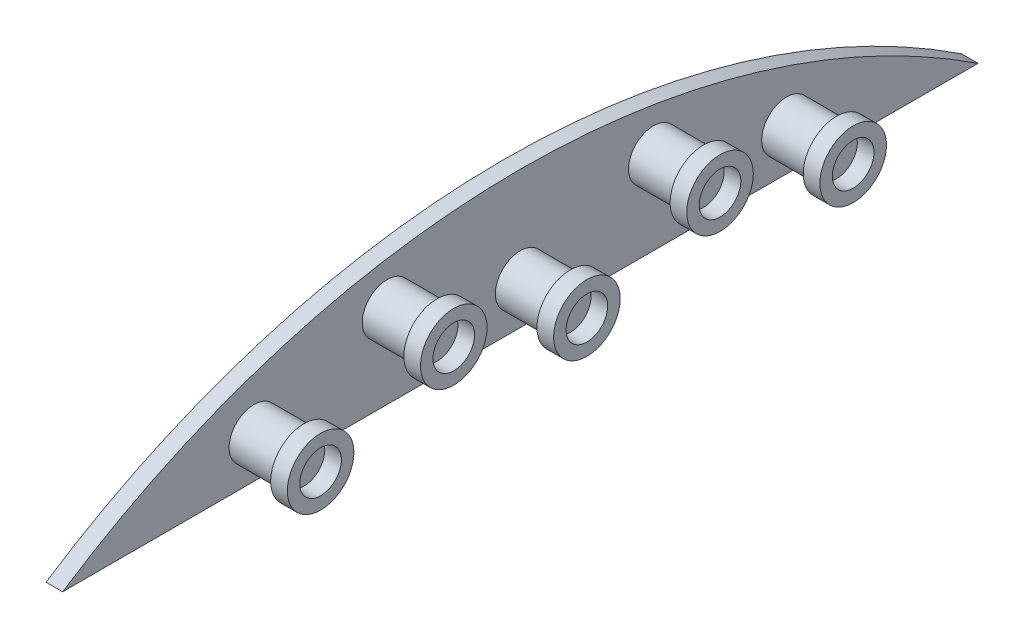
ISO-10303-21;
HEADER;
FILE_DESCRIPTION(('STEP AP214'),'2;1');
FILE_NAME('part.step','',(''),(''),'','','');
FILE_SCHEMA(('AUTOMOTIVE_DESIGN { 1 0 10303 214 1 1 1 1 }'));
ENDSEC;
DATA;
#1=APPLICATION_CONTEXT('core data for automotive mechanical design processes');
#2=APPLICATION_PROTOCOL_DEFINITION('international standard','automotive_design',2000,#1);
#3=PRODUCT_CONTEXT('',#1,'mechanical');
#4=PRODUCT('Part','Part','',(#3));
#5=PRODUCT_RELATED_PRODUCT_CATEGORY('part','',(#4));
#6=PRODUCT_DEFINITION_FORMATION('','',#4);
#7=PRODUCT_DEFINITION_CONTEXT('part definition',#1,'design');
#8=PRODUCT_DEFINITION('design','',#6,#7);
#9=PRODUCT_DEFINITION_SHAPE('','',#8);
#10=(LENGTH_UNIT() NAMED_UNIT(*) SI_UNIT(.MILLI.,.METRE.));
#11=(NAMED_UNIT(*) PLANE_ANGLE_UNIT() SI_UNIT($,.RADIAN.));
#12=(NAMED_UNIT(*) SI_UNIT($,.STERADIAN.) SOLID_ANGLE_UNIT());
#13=UNCERTAINTY_MEASURE_WITH_UNIT(LENGTH_MEASURE(1.E-05),#10,'distance_accuracy_value','');
#14=(GEOMETRIC_REPRESENTATION_CONTEXT(3) GLOBAL_UNCERTAINTY_ASSIGNED_CONTEXT((#13)) GLOBAL_UNIT_ASSIGNED_CONTEXT((#10,
#11,#12)) REPRESENTATION_CONTEXT('',''));
#15=CARTESIAN_POINT('',(0.,0.,0.));
#16=DIRECTION('',(0.,0.,1.));
#17=DIRECTION('',(1.,0.,0.));
#18=AXIS2_PLACEMENT_3D('',#15,#16,#17);
#19=CARTESIAN_POINT('',(2.,8.24176727877485,-141.656637829777));
#20=DIRECTION('',(1.,0.,0.));
#21=DIRECTION('',(0.,0.,-1.));
#22=AXIS2_PLACEMENT_3D('',#19,#20,#21);
#23=PLANE('',#22);
#24=CARTESIAN_POINT('',(2.,10.,-71.));
#25=DIRECTION('',(1.,0.,0.));
#26=DIRECTION('',(0.,0.,-1.));
#27=AXIS2_PLACEMENT_3D('',#24,#25,#26);
#28=CIRCLE('',#27,3.00000000000001);
#29=CARTESIAN_POINT('',(2.,10.,-74.));
#30=VERTEX_POINT('',#29);
#31=EDGE_CURVE('E204',#30,#30,#28,.T.);
#32=ORIENTED_EDGE('',*,*,#31,.F.);
#33=EDGE_LOOP('',(#32));
#34=FACE_BOUND('',#33,.T.);
#35=CARTESIAN_POINT('',(2.,10.,-39.));
#36=DIRECTION('',(1.,0.,0.));
#37=DIRECTION('',(0.,0.,-1.));
#38=AXIS2_PLACEMENT_3D('',#35,#36,#37);
#39=CIRCLE('',#38,3.);
#40=CARTESIAN_POINT('',(2.,10.,-42.));
#41=VERTEX_POINT('',#40);
#42=EDGE_CURVE('E219',#41,#41,#39,.T.);
#43=ORIENTED_EDGE('',*,*,#42,.F.);
#44=EDGE_LOOP('',(#43));
#45=FACE_BOUND('',#44,.T.);
#46=DIRECTION('',(0.,0.,-1.));
#47=VECTOR('',#46,1.);
#48=CARTESIAN_POINT('',(2.,0.,-141.656637829777));
#49=LINE('',#48,#47);
#50=CARTESIAN_POINT('',(2.,0.,0.));
#51=VERTEX_POINT('',#50);
#52=CARTESIAN_POINT('',(2.,0.,-110.));
#53=VERTEX_POINT('',#52);
#54=EDGE_CURVE('E93',#51,#53,#49,.T.);
#55=ORIENTED_EDGE('',*,*,#54,.T.);
#56=CARTESIAN_POINT('',(2.,-83.5164654424503,-55.));
#57=DIRECTION('',(1.,0.,0.));
#58=DIRECTION('',(0.,0.,-1.));
#59=AXIS2_PLACEMENT_3D('',#56,#57,#58);
#60=CIRCLE('',#59,100.);
#61=EDGE_CURVE('E76',#53,#51,#60,.T.);
#62=ORIENTED_EDGE('',*,*,#61,.T.);
#63=EDGE_LOOP('',(#55,#62));
#64=FACE_BOUND('',#63,.T.);
#65=CARTESIAN_POINT('',(2.,5.,-23.));
#66=DIRECTION('',(1.,0.,0.));
#67=DIRECTION('',(0.,0.,-1.));
#68=AXIS2_PLACEMENT_3D('',#65,#66,#67);
#69=CIRCLE('',#68,3.);
#70=CARTESIAN_POINT('',(2.,5.,-26.));
#71=VERTEX_POINT('',#70);
#72=EDGE_CURVE('E106',#71,#71,#69,.T.);
#73=ORIENTED_EDGE('',*,*,#72,.F.);
#74=EDGE_LOOP('',(#73));
#75=FACE_BOUND('',#74,.T.);
#76=CARTESIAN_POINT('',(2.,5.,-55.));
#77=DIRECTION('',(1.,0.,0.));
#78=DIRECTION('',(0.,0.,-1.));
#79=AXIS2_PLACEMENT_3D('',#76,#77,#78);
#80=CIRCLE('',#79,3.);
#81=CARTESIAN_POINT('',(2.,5.,-58.));
#82=VERTEX_POINT('',#81);
#83=EDGE_CURVE('E207',#82,#82,#80,.T.);
#84=ORIENTED_EDGE('',*,*,#83,.F.);
#85=EDGE_LOOP('',(#84));
#86=FACE_BOUND('',#85,.T.);
#87=CARTESIAN_POINT('',(2.,5.,-87.));
#88=DIRECTION('',(1.,0.,0.));
#89=DIRECTION('',(0.,0.,-1.));
#90=AXIS2_PLACEMENT_3D('',#87,#88,#89);
#91=CIRCLE('',#90,3.00000000000001);
#92=CARTESIAN_POINT('',(2.,5.,-90.));
#93=VERTEX_POINT('',#92);
#94=EDGE_CURVE('E210',#93,#93,#91,.T.);
#95=ORIENTED_EDGE('',*,*,#94,.F.);
#96=EDGE_LOOP('',(#95));
#97=FACE_BOUND('',#96,.T.);
#98=ADVANCED_FACE('F62',(#34,#45,#64,#75,#86,#97),#23,.T.);
#99=CARTESIAN_POINT('',(2.,0.,-141.656637829777));
#100=DIRECTION('',(0.,1.,0.));
#101=DIRECTION('',(0.,0.,1.));
#102=AXIS2_PLACEMENT_3D('',#99,#100,#101);
#103=PLANE('',#102);
#104=DIRECTION('',(0.,0.,-1.));
#105=VECTOR('',#104,1.);
#106=CARTESIAN_POINT('',(0.,0.,-141.656637829777));
#107=LINE('',#106,#105);
#108=CARTESIAN_POINT('',(0.,0.,0.));
#109=VERTEX_POINT('',#108);
#110=CARTESIAN_POINT('',(0.,0.,-110.));
#111=VERTEX_POINT('',#110);
#112=EDGE_CURVE('E91',#109,#111,#107,.T.);
#113=ORIENTED_EDGE('',*,*,#112,.T.);
#114=DIRECTION('',(-1.,0.,0.));
#115=VECTOR('',#114,1.);
#116=CARTESIAN_POINT('',(2.,0.,-110.));
#117=LINE('',#116,#115);
#118=EDGE_CURVE('E96',#53,#111,#117,.T.);
#119=ORIENTED_EDGE('',*,*,#118,.F.);
#120=ORIENTED_EDGE('',*,*,#54,.F.);
#121=DIRECTION('',(-1.,0.,0.));
#122=VECTOR('',#121,1.);
#123=CARTESIAN_POINT('',(2.,0.,0.));
#124=LINE('',#123,#122);
#125=EDGE_CURVE('E101',#51,#109,#124,.T.);
#126=ORIENTED_EDGE('',*,*,#125,.T.);
#127=EDGE_LOOP('',(#113,#119,#120,#126));
#128=FACE_BOUND('',#127,.T.);
#129=ADVANCED_FACE('F64',(#128),#103,.F.);
#130=CARTESIAN_POINT('',(2.,-83.5164654424503,-55.));
#131=DIRECTION('',(-1.,0.,0.));
#132=DIRECTION('',(0.,0.,1.));
#133=AXIS2_PLACEMENT_3D('',#130,#131,#132);
#134=CYLINDRICAL_SURFACE('',#133,100.);
#135=CARTESIAN_POINT('',(0.,-83.5164654424503,-55.));
#136=DIRECTION('',(1.,0.,0.));
#137=DIRECTION('',(0.,0.,-1.));
#138=AXIS2_PLACEMENT_3D('',#135,#136,#137);
#139=CIRCLE('',#138,100.);
#140=EDGE_CURVE('E88',#111,#109,#139,.T.);
#141=ORIENTED_EDGE('',*,*,#140,.T.);
#142=ORIENTED_EDGE('',*,*,#125,.F.);
#143=ORIENTED_EDGE('',*,*,#61,.F.);
#144=ORIENTED_EDGE('',*,*,#118,.T.);
#145=EDGE_LOOP('',(#141,#142,#143,#144));
#146=FACE_BOUND('',#145,.T.);
#147=ADVANCED_FACE('F97',(#146),#134,.T.);
#148=CARTESIAN_POINT('',(0.,8.24176727877485,-141.656637829777));
#149=DIRECTION('',(1.,0.,0.));
#150=DIRECTION('',(0.,0.,-1.));
#151=AXIS2_PLACEMENT_3D('',#148,#149,#150);
#152=PLANE('',#151);
#153=ORIENTED_EDGE('',*,*,#112,.F.);
#154=ORIENTED_EDGE('',*,*,#140,.F.);
#155=EDGE_LOOP('',(#153,#154));
#156=FACE_BOUND('',#155,.T.);
#157=ADVANCED_FACE('F89',(#156),#152,.F.);
#158=CARTESIAN_POINT('',(8.,5.,-23.));
#159=DIRECTION('',(-1.,0.,0.));
#160=DIRECTION('',(0.,0.,1.));
#161=AXIS2_PLACEMENT_3D('',#158,#159,#160);
#162=CYLINDRICAL_SURFACE('',#161,3.);
#163=CARTESIAN_POINT('',(8.,5.,-23.));
#164=DIRECTION('',(1.,0.,0.));
#165=DIRECTION('',(0.,0.,-1.));
#166=AXIS2_PLACEMENT_3D('',#163,#164,#165);
#167=CIRCLE('',#166,3.);
#168=CARTESIAN_POINT('',(8.,5.,-26.));
#169=VERTEX_POINT('',#168);
#170=EDGE_CURVE('E103',#169,#169,#167,.T.);
#171=ORIENTED_EDGE('',*,*,#170,.F.);
#172=EDGE_LOOP('',(#171));
#173=FACE_BOUND('',#172,.T.);
#174=ORIENTED_EDGE('',*,*,#72,.T.);
#175=EDGE_LOOP('',(#174));
#176=FACE_BOUND('',#175,.T.);
#177=ADVANCED_FACE('F155',(#173,#176),#162,.T.);
#178=CARTESIAN_POINT('',(8.,10.,-39.));
#179=DIRECTION('',(-1.,0.,0.));
#180=DIRECTION('',(0.,0.,1.));
#181=AXIS2_PLACEMENT_3D('',#178,#179,#180);
#182=CYLINDRICAL_SURFACE('',#181,3.);
#183=CARTESIAN_POINT('',(8.,10.,-39.));
#184=DIRECTION('',(1.,0.,0.));
#185=DIRECTION('',(0.,0.,-1.));
#186=AXIS2_PLACEMENT_3D('',#183,#184,#185);
#187=CIRCLE('',#186,3.);
#188=CARTESIAN_POINT('',(8.,10.,-42.));
#189=VERTEX_POINT('',#188);
#190=EDGE_CURVE('E222',#189,#189,#187,.T.);
#191=ORIENTED_EDGE('',*,*,#190,.F.);
#192=EDGE_LOOP('',(#191));
#193=FACE_BOUND('',#192,.T.);
#194=ORIENTED_EDGE('',*,*,#42,.T.);
#195=EDGE_LOOP('',(#194));
#196=FACE_BOUND('',#195,.T.);
#197=ADVANCED_FACE('F159',(#193,#196),#182,.T.);
#198=CARTESIAN_POINT('',(8.,5.,-55.));
#199=DIRECTION('',(-1.,0.,0.));
#200=DIRECTION('',(0.,0.,1.));
#201=AXIS2_PLACEMENT_3D('',#198,#199,#200);
#202=CYLINDRICAL_SURFACE('',#201,3.);
#203=CARTESIAN_POINT('',(8.,5.,-55.));
#204=DIRECTION('',(1.,0.,0.));
#205=DIRECTION('',(0.,0.,-1.));
#206=AXIS2_PLACEMENT_3D('',#203,#204,#205);
#207=CIRCLE('',#206,3.);
#208=CARTESIAN_POINT('',(8.,5.,-58.));
#209=VERTEX_POINT('',#208);
#210=EDGE_CURVE('E216',#209,#209,#207,.T.);
#211=ORIENTED_EDGE('',*,*,#210,.F.);
#212=EDGE_LOOP('',(#211));
#213=FACE_BOUND('',#212,.T.);
#214=ORIENTED_EDGE('',*,*,#83,.T.);
#215=EDGE_LOOP('',(#214));
#216=FACE_BOUND('',#215,.T.);
#217=ADVANCED_FACE('F164',(#213,#216),#202,.T.);
#218=CARTESIAN_POINT('',(8.,10.,-71.));
#219=DIRECTION('',(-1.,0.,0.));
#220=DIRECTION('',(0.,0.,1.));
#221=AXIS2_PLACEMENT_3D('',#218,#219,#220);
#222=CYLINDRICAL_SURFACE('',#221,3.00000000000001);
#223=CARTESIAN_POINT('',(8.,10.,-71.));
#224=DIRECTION('',(1.,0.,0.));
#225=DIRECTION('',(0.,0.,-1.));
#226=AXIS2_PLACEMENT_3D('',#223,#224,#225);
#227=CIRCLE('',#226,3.00000000000001);
#228=CARTESIAN_POINT('',(8.,10.,-74.));
#229=VERTEX_POINT('',#228);
#230=EDGE_CURVE('E202',#229,#229,#227,.T.);
#231=ORIENTED_EDGE('',*,*,#230,.F.);
#232=EDGE_LOOP('',(#231));
#233=FACE_BOUND('',#232,.T.);
#234=ORIENTED_EDGE('',*,*,#31,.T.);
#235=EDGE_LOOP('',(#234));
#236=FACE_BOUND('',#235,.T.);
#237=ADVANCED_FACE('F184',(#233,#236),#222,.T.);
#238=CARTESIAN_POINT('',(8.,5.,-87.));
#239=DIRECTION('',(-1.,0.,0.));
#240=DIRECTION('',(0.,0.,1.));
#241=AXIS2_PLACEMENT_3D('',#238,#239,#240);
#242=CYLINDRICAL_SURFACE('',#241,3.00000000000001);
#243=CARTESIAN_POINT('',(8.,5.,-87.));
#244=DIRECTION('',(1.,0.,0.));
#245=DIRECTION('',(0.,0.,-1.));
#246=AXIS2_PLACEMENT_3D('',#243,#244,#245);
#247=CIRCLE('',#246,3.00000000000001);
#248=CARTESIAN_POINT('',(8.,5.,-90.));
#249=VERTEX_POINT('',#248);
#250=EDGE_CURVE('E205',#249,#249,#247,.T.);
#251=ORIENTED_EDGE('',*,*,#250,.F.);
#252=EDGE_LOOP('',(#251));
#253=FACE_BOUND('',#252,.T.);
#254=ORIENTED_EDGE('',*,*,#94,.T.);
#255=EDGE_LOOP('',(#254));
#256=FACE_BOUND('',#255,.T.);
#257=ADVANCED_FACE('F192',(#253,#256),#242,.T.);
#258=CARTESIAN_POINT('',(8.,5.,-23.));
#259=DIRECTION('',(1.,0.,0.));
#260=DIRECTION('',(0.,0.,-1.));
#261=AXIS2_PLACEMENT_3D('',#258,#259,#260);
#262=PLANE('',#261);
#263=CARTESIAN_POINT('',(8.,5.,-23.));
#264=DIRECTION('',(1.,0.,0.));
#265=DIRECTION('',(0.,0.,-1.));
#266=AXIS2_PLACEMENT_3D('',#263,#264,#265);
#267=CIRCLE('',#266,4.);
#268=CARTESIAN_POINT('',(8.,5.,-27.));
#269=VERTEX_POINT('',#268);
#270=EDGE_CURVE('E235',#269,#269,#267,.T.);
#271=ORIENTED_EDGE('',*,*,#270,.F.);
#272=EDGE_LOOP('',(#271));
#273=FACE_BOUND('',#272,.T.);
#274=ORIENTED_EDGE('',*,*,#170,.T.);
#275=EDGE_LOOP('',(#274));
#276=FACE_BOUND('',#275,.T.);
#277=ADVANCED_FACE('F197',(#273,#276),#262,.F.);
#278=CARTESIAN_POINT('',(10.,5.,-23.));
#279=DIRECTION('',(1.,0.,0.));
#280=DIRECTION('',(0.,0.,-1.));
#281=AXIS2_PLACEMENT_3D('',#278,#279,#280);
#282=PLANE('',#281);
#283=CARTESIAN_POINT('',(10.,5.,-23.));
#284=DIRECTION('',(1.,0.,0.));
#285=DIRECTION('',(0.,0.,-1.));
#286=AXIS2_PLACEMENT_3D('',#283,#284,#285);
#287=CIRCLE('',#286,4.);
#288=CARTESIAN_POINT('',(10.,5.,-27.));
#289=VERTEX_POINT('',#288);
#290=EDGE_CURVE('E233',#289,#289,#287,.T.);
#291=ORIENTED_EDGE('',*,*,#290,.T.);
#292=EDGE_LOOP('',(#291));
#293=FACE_BOUND('',#292,.T.);
#294=CARTESIAN_POINT('',(10.,5.,-23.));
#295=DIRECTION('',(1.,0.,0.));
#296=DIRECTION('',(0.,0.,-1.));
#297=AXIS2_PLACEMENT_3D('',#294,#295,#296);
#298=CIRCLE('',#297,2.5);
#299=CARTESIAN_POINT('',(10.,5.,-25.5));
#300=VERTEX_POINT('',#299);
#301=EDGE_CURVE('E240',#300,#300,#298,.T.);
#302=ORIENTED_EDGE('',*,*,#301,.F.);
#303=EDGE_LOOP('',(#302));
#304=FACE_BOUND('',#303,.T.);
#305=ADVANCED_FACE('F343',(#293,#304),#282,.T.);
#306=CARTESIAN_POINT('',(10.,5.,-23.));
#307=DIRECTION('',(-1.,0.,0.));
#308=DIRECTION('',(0.,0.,1.));
#309=AXIS2_PLACEMENT_3D('',#306,#307,#308);
#310=CYLINDRICAL_SURFACE('',#309,4.);
#311=ORIENTED_EDGE('',*,*,#290,.F.);
#312=EDGE_LOOP('',(#311));
#313=FACE_BOUND('',#312,.T.);
#314=ORIENTED_EDGE('',*,*,#270,.T.);
#315=EDGE_LOOP('',(#314));
#316=FACE_BOUND('',#315,.T.);
#317=ADVANCED_FACE('F339',(#313,#316),#310,.T.);
#318=CARTESIAN_POINT('',(10.,5.,-23.));
#319=DIRECTION('',(-1.,0.,0.));
#320=DIRECTION('',(0.,0.,1.));
#321=AXIS2_PLACEMENT_3D('',#318,#319,#320);
#322=CYLINDRICAL_SURFACE('',#321,2.5);
#323=ORIENTED_EDGE('',*,*,#301,.T.);
#324=EDGE_LOOP('',(#323));
#325=FACE_BOUND('',#324,.T.);
#326=CARTESIAN_POINT('',(8.,5.,-23.));
#327=DIRECTION('',(1.,0.,0.));
#328=DIRECTION('',(0.,0.,-1.));
#329=AXIS2_PLACEMENT_3D('',#326,#327,#328);
#330=CIRCLE('',#329,2.5);
#331=CARTESIAN_POINT('',(8.,5.,-25.5));
#332=VERTEX_POINT('',#331);
#333=EDGE_CURVE('E100',#332,#332,#330,.F.);
#334=ORIENTED_EDGE('',*,*,#333,.T.);
#335=EDGE_LOOP('',(#334));
#336=FACE_BOUND('',#335,.T.);
#337=ADVANCED_FACE('F173',(#325,#336),#322,.F.);
#338=CARTESIAN_POINT('',(8.,5.,-23.));
#339=DIRECTION('',(1.,0.,0.));
#340=DIRECTION('',(0.,0.,-1.));
#341=AXIS2_PLACEMENT_3D('',#338,#339,#340);
#342=PLANE('',#341);
#343=ORIENTED_EDGE('',*,*,#333,.F.);
#344=EDGE_LOOP('',(#343));
#345=FACE_BOUND('',#344,.T.);
#346=ADVANCED_FACE('F170',(#345),#342,.T.);
#347=CARTESIAN_POINT('',(8.,10.,-39.));
#348=DIRECTION('',(1.,0.,0.));
#349=DIRECTION('',(0.,0.,-1.));
#350=AXIS2_PLACEMENT_3D('',#347,#348,#349);
#351=PLANE('',#350);
#352=CARTESIAN_POINT('',(8.,10.,-39.));
#353=DIRECTION('',(1.,0.,0.));
#354=DIRECTION('',(0.,0.,-1.));
#355=AXIS2_PLACEMENT_3D('',#352,#353,#354);
#356=CIRCLE('',#355,4.00000000000001);
#357=CARTESIAN_POINT('',(8.,10.,-43.));
#358=VERTEX_POINT('',#357);
#359=EDGE_CURVE('E246',#358,#358,#356,.T.);
#360=ORIENTED_EDGE('',*,*,#359,.F.);
#361=EDGE_LOOP('',(#360));
#362=FACE_BOUND('',#361,.T.);
#363=ORIENTED_EDGE('',*,*,#190,.T.);
#364=EDGE_LOOP('',(#363));
#365=FACE_BOUND('',#364,.T.);
#366=ADVANCED_FACE('F172',(#362,#365),#351,.F.);
#367=CARTESIAN_POINT('',(10.,10.,-39.));
#368=DIRECTION('',(1.,0.,0.));
#369=DIRECTION('',(0.,0.,-1.));
#370=AXIS2_PLACEMENT_3D('',#367,#368,#369);
#371=PLANE('',#370);
#372=CARTESIAN_POINT('',(10.,10.,-39.));
#373=DIRECTION('',(1.,0.,0.));
#374=DIRECTION('',(0.,0.,-1.));
#375=AXIS2_PLACEMENT_3D('',#372,#373,#374);
#376=CIRCLE('',#375,4.00000000000001);
#377=CARTESIAN_POINT('',(10.,10.,-43.));
#378=VERTEX_POINT('',#377);
#379=EDGE_CURVE('E249',#378,#378,#376,.T.);
#380=ORIENTED_EDGE('',*,*,#379,.T.);
#381=EDGE_LOOP('',(#380));
#382=FACE_BOUND('',#381,.T.);
#383=CARTESIAN_POINT('',(10.,10.,-39.));
#384=DIRECTION('',(1.,0.,0.));
#385=DIRECTION('',(0.,0.,-1.));
#386=AXIS2_PLACEMENT_3D('',#383,#384,#385);
#387=CIRCLE('',#386,2.5);
#388=CARTESIAN_POINT('',(10.,10.,-41.5));
#389=VERTEX_POINT('',#388);
#390=EDGE_CURVE('E243',#389,#389,#387,.T.);
#391=ORIENTED_EDGE('',*,*,#390,.F.);
#392=EDGE_LOOP('',(#391));
#393=FACE_BOUND('',#392,.T.);
#394=ADVANCED_FACE('F326',(#382,#393),#371,.T.);
#395=CARTESIAN_POINT('',(10.,10.,-39.));
#396=DIRECTION('',(-1.,0.,0.));
#397=DIRECTION('',(0.,0.,1.));
#398=AXIS2_PLACEMENT_3D('',#395,#396,#397);
#399=CYLINDRICAL_SURFACE('',#398,4.00000000000001);
#400=ORIENTED_EDGE('',*,*,#379,.F.);
#401=EDGE_LOOP('',(#400));
#402=FACE_BOUND('',#401,.T.);
#403=ORIENTED_EDGE('',*,*,#359,.T.);
#404=EDGE_LOOP('',(#403));
#405=FACE_BOUND('',#404,.T.);
#406=ADVANCED_FACE('F323',(#402,#405),#399,.T.);
#407=CARTESIAN_POINT('',(10.,10.,-39.));
#408=DIRECTION('',(-1.,0.,0.));
#409=DIRECTION('',(0.,0.,1.));
#410=AXIS2_PLACEMENT_3D('',#407,#408,#409);
#411=CYLINDRICAL_SURFACE('',#410,2.5);
#412=ORIENTED_EDGE('',*,*,#390,.T.);
#413=EDGE_LOOP('',(#412));
#414=FACE_BOUND('',#413,.T.);
#415=CARTESIAN_POINT('',(8.,10.,-39.));
#416=DIRECTION('',(1.,0.,0.));
#417=DIRECTION('',(0.,0.,-1.));
#418=AXIS2_PLACEMENT_3D('',#415,#416,#417);
#419=CIRCLE('',#418,2.5);
#420=CARTESIAN_POINT('',(8.,10.,-41.5));
#421=VERTEX_POINT('',#420);
#422=EDGE_CURVE('E115',#421,#421,#419,.F.);
#423=ORIENTED_EDGE('',*,*,#422,.T.);
#424=EDGE_LOOP('',(#423));
#425=FACE_BOUND('',#424,.T.);
#426=ADVANCED_FACE('F180',(#414,#425),#411,.F.);
#427=CARTESIAN_POINT('',(8.,10.,-39.));
#428=DIRECTION('',(1.,0.,0.));
#429=DIRECTION('',(0.,0.,-1.));
#430=AXIS2_PLACEMENT_3D('',#427,#428,#429);
#431=PLANE('',#430);
#432=ORIENTED_EDGE('',*,*,#422,.F.);
#433=EDGE_LOOP('',(#432));
#434=FACE_BOUND('',#433,.T.);
#435=ADVANCED_FACE('F176',(#434),#431,.T.);
#436=CARTESIAN_POINT('',(8.,5.,-55.));
#437=DIRECTION('',(1.,0.,0.));
#438=DIRECTION('',(0.,0.,-1.));
#439=AXIS2_PLACEMENT_3D('',#436,#437,#438);
#440=PLANE('',#439);
#441=CARTESIAN_POINT('',(8.,5.,-55.));
#442=DIRECTION('',(1.,0.,0.));
#443=DIRECTION('',(0.,0.,-1.));
#444=AXIS2_PLACEMENT_3D('',#441,#442,#443);
#445=CIRCLE('',#444,4.);
#446=CARTESIAN_POINT('',(8.,5.,-59.));
#447=VERTEX_POINT('',#446);
#448=EDGE_CURVE('E255',#447,#447,#445,.T.);
#449=ORIENTED_EDGE('',*,*,#448,.F.);
#450=EDGE_LOOP('',(#449));
#451=FACE_BOUND('',#450,.T.);
#452=ORIENTED_EDGE('',*,*,#210,.T.);
#453=EDGE_LOOP('',(#452));
#454=FACE_BOUND('',#453,.T.);
#455=ADVANCED_FACE('F179',(#451,#454),#440,.F.);
#456=CARTESIAN_POINT('',(10.,5.,-55.));
#457=DIRECTION('',(1.,0.,0.));
#458=DIRECTION('',(0.,0.,-1.));
#459=AXIS2_PLACEMENT_3D('',#456,#457,#458);
#460=PLANE('',#459);
#461=CARTESIAN_POINT('',(10.,5.,-55.));
#462=DIRECTION('',(1.,0.,0.));
#463=DIRECTION('',(0.,0.,-1.));
#464=AXIS2_PLACEMENT_3D('',#461,#462,#463);
#465=CIRCLE('',#464,4.);
#466=CARTESIAN_POINT('',(10.,5.,-59.));
#467=VERTEX_POINT('',#466);
#468=EDGE_CURVE('E258',#467,#467,#465,.T.);
#469=ORIENTED_EDGE('',*,*,#468,.T.);
#470=EDGE_LOOP('',(#469));
#471=FACE_BOUND('',#470,.T.);
#472=CARTESIAN_POINT('',(10.,5.,-55.));
#473=DIRECTION('',(1.,0.,0.));
#474=DIRECTION('',(0.,0.,-1.));
#475=AXIS2_PLACEMENT_3D('',#472,#473,#474);
#476=CIRCLE('',#475,2.5);
#477=CARTESIAN_POINT('',(10.,5.,-57.5));
#478=VERTEX_POINT('',#477);
#479=EDGE_CURVE('E252',#478,#478,#476,.T.);
#480=ORIENTED_EDGE('',*,*,#479,.F.);
#481=EDGE_LOOP('',(#480));
#482=FACE_BOUND('',#481,.T.);
#483=ADVANCED_FACE('F312',(#471,#482),#460,.T.);
#484=CARTESIAN_POINT('',(10.,5.,-55.));
#485=DIRECTION('',(-1.,0.,0.));
#486=DIRECTION('',(0.,0.,1.));
#487=AXIS2_PLACEMENT_3D('',#484,#485,#486);
#488=CYLINDRICAL_SURFACE('',#487,4.);
#489=ORIENTED_EDGE('',*,*,#468,.F.);
#490=EDGE_LOOP('',(#489));
#491=FACE_BOUND('',#490,.T.);
#492=ORIENTED_EDGE('',*,*,#448,.T.);
#493=EDGE_LOOP('',(#492));
#494=FACE_BOUND('',#493,.T.);
#495=ADVANCED_FACE('F309',(#491,#494),#488,.T.);
#496=CARTESIAN_POINT('',(10.,5.,-55.));
#497=DIRECTION('',(-1.,0.,0.));
#498=DIRECTION('',(0.,0.,1.));
#499=AXIS2_PLACEMENT_3D('',#496,#497,#498);
#500=CYLINDRICAL_SURFACE('',#499,2.5);
#501=ORIENTED_EDGE('',*,*,#479,.T.);
#502=EDGE_LOOP('',(#501));
#503=FACE_BOUND('',#502,.T.);
#504=CARTESIAN_POINT('',(8.,5.,-55.));
#505=DIRECTION('',(1.,0.,0.));
#506=DIRECTION('',(0.,0.,-1.));
#507=AXIS2_PLACEMENT_3D('',#504,#505,#506);
#508=CIRCLE('',#507,2.5);
#509=CARTESIAN_POINT('',(8.,5.,-57.5));
#510=VERTEX_POINT('',#509);
#511=EDGE_CURVE('E118',#510,#510,#508,.F.);
#512=ORIENTED_EDGE('',*,*,#511,.T.);
#513=EDGE_LOOP('',(#512));
#514=FACE_BOUND('',#513,.T.);
#515=ADVANCED_FACE('F189',(#503,#514),#500,.F.);
#516=CARTESIAN_POINT('',(8.,5.,-55.));
#517=DIRECTION('',(1.,0.,0.));
#518=DIRECTION('',(0.,0.,-1.));
#519=AXIS2_PLACEMENT_3D('',#516,#517,#518);
#520=PLANE('',#519);
#521=ORIENTED_EDGE('',*,*,#511,.F.);
#522=EDGE_LOOP('',(#521));
#523=FACE_BOUND('',#522,.T.);
#524=ADVANCED_FACE('F186',(#523),#520,.T.);
#525=CARTESIAN_POINT('',(8.,10.,-71.));
#526=DIRECTION('',(1.,0.,0.));
#527=DIRECTION('',(0.,0.,-1.));
#528=AXIS2_PLACEMENT_3D('',#525,#526,#527);
#529=PLANE('',#528);
#530=CARTESIAN_POINT('',(8.,10.,-71.));
#531=DIRECTION('',(1.,0.,0.));
#532=DIRECTION('',(0.,0.,-1.));
#533=AXIS2_PLACEMENT_3D('',#530,#531,#532);
#534=CIRCLE('',#533,4.00000000000001);
#535=CARTESIAN_POINT('',(8.,10.,-75.));
#536=VERTEX_POINT('',#535);
#537=EDGE_CURVE('E264',#536,#536,#534,.T.);
#538=ORIENTED_EDGE('',*,*,#537,.F.);
#539=EDGE_LOOP('',(#538));
#540=FACE_BOUND('',#539,.T.);
#541=ORIENTED_EDGE('',*,*,#230,.T.);
#542=EDGE_LOOP('',(#541));
#543=FACE_BOUND('',#542,.T.);
#544=ADVANCED_FACE('F188',(#540,#543),#529,.F.);
#545=CARTESIAN_POINT('',(10.,10.,-71.));
#546=DIRECTION('',(1.,0.,0.));
#547=DIRECTION('',(0.,0.,-1.));
#548=AXIS2_PLACEMENT_3D('',#545,#546,#547);
#549=PLANE('',#548);
#550=CARTESIAN_POINT('',(10.,10.,-71.));
#551=DIRECTION('',(1.,0.,0.));
#552=DIRECTION('',(0.,0.,-1.));
#553=AXIS2_PLACEMENT_3D('',#550,#551,#552);
#554=CIRCLE('',#553,4.00000000000001);
#555=CARTESIAN_POINT('',(10.,10.,-75.));
#556=VERTEX_POINT('',#555);
#557=EDGE_CURVE('E267',#556,#556,#554,.T.);
#558=ORIENTED_EDGE('',*,*,#557,.T.);
#559=EDGE_LOOP('',(#558));
#560=FACE_BOUND('',#559,.T.);
#561=CARTESIAN_POINT('',(10.,10.,-71.));
#562=DIRECTION('',(1.,0.,0.));
#563=DIRECTION('',(0.,0.,-1.));
#564=AXIS2_PLACEMENT_3D('',#561,#562,#563);
#565=CIRCLE('',#564,2.5);
#566=CARTESIAN_POINT('',(10.,10.,-73.5));
#567=VERTEX_POINT('',#566);
#568=EDGE_CURVE('E261',#567,#567,#565,.T.);
#569=ORIENTED_EDGE('',*,*,#568,.F.);
#570=EDGE_LOOP('',(#569));
#571=FACE_BOUND('',#570,.T.);
#572=ADVANCED_FACE('F301',(#560,#571),#549,.T.);
#573=CARTESIAN_POINT('',(10.,10.,-71.));
#574=DIRECTION('',(-1.,0.,0.));
#575=DIRECTION('',(0.,0.,1.));
#576=AXIS2_PLACEMENT_3D('',#573,#574,#575);
#577=CYLINDRICAL_SURFACE('',#576,4.00000000000001);
#578=ORIENTED_EDGE('',*,*,#557,.F.);
#579=EDGE_LOOP('',(#578));
#580=FACE_BOUND('',#579,.T.);
#581=ORIENTED_EDGE('',*,*,#537,.T.);
#582=EDGE_LOOP('',(#581));
#583=FACE_BOUND('',#582,.T.);
#584=ADVANCED_FACE('F136',(#580,#583),#577,.T.);
#585=CARTESIAN_POINT('',(10.,10.,-71.));
#586=DIRECTION('',(-1.,0.,0.));
#587=DIRECTION('',(0.,0.,1.));
#588=AXIS2_PLACEMENT_3D('',#585,#586,#587);
#589=CYLINDRICAL_SURFACE('',#588,2.5);
#590=ORIENTED_EDGE('',*,*,#568,.T.);
#591=EDGE_LOOP('',(#590));
#592=FACE_BOUND('',#591,.T.);
#593=CARTESIAN_POINT('',(8.,10.,-71.));
#594=DIRECTION('',(1.,0.,0.));
#595=DIRECTION('',(0.,0.,-1.));
#596=AXIS2_PLACEMENT_3D('',#593,#594,#595);
#597=CIRCLE('',#596,2.5);
#598=CARTESIAN_POINT('',(8.,10.,-73.5));
#599=VERTEX_POINT('',#598);
#600=EDGE_CURVE('E70',#599,#599,#597,.F.);
#601=ORIENTED_EDGE('',*,*,#600,.T.);
#602=EDGE_LOOP('',(#601));
#603=FACE_BOUND('',#602,.T.);
#604=ADVANCED_FACE('F123',(#592,#603),#589,.F.);
#605=CARTESIAN_POINT('',(8.,10.,-71.));
#606=DIRECTION('',(1.,0.,0.));
#607=DIRECTION('',(0.,0.,-1.));
#608=AXIS2_PLACEMENT_3D('',#605,#606,#607);
#609=PLANE('',#608);
#610=ORIENTED_EDGE('',*,*,#600,.F.);
#611=EDGE_LOOP('',(#610));
#612=FACE_BOUND('',#611,.T.);
#613=ADVANCED_FACE('F125',(#612),#609,.T.);
#614=CARTESIAN_POINT('',(8.,5.,-87.));
#615=DIRECTION('',(1.,0.,0.));
#616=DIRECTION('',(0.,0.,-1.));
#617=AXIS2_PLACEMENT_3D('',#614,#615,#616);
#618=PLANE('',#617);
#619=CARTESIAN_POINT('',(8.,5.,-87.));
#620=DIRECTION('',(1.,0.,0.));
#621=DIRECTION('',(0.,0.,-1.));
#622=AXIS2_PLACEMENT_3D('',#619,#620,#621);
#623=CIRCLE('',#622,4.00000000000001);
#624=CARTESIAN_POINT('',(8.,5.,-91.));
#625=VERTEX_POINT('',#624);
#626=EDGE_CURVE('E273',#625,#625,#623,.T.);
#627=ORIENTED_EDGE('',*,*,#626,.F.);
#628=EDGE_LOOP('',(#627));
#629=FACE_BOUND('',#628,.T.);
#630=ORIENTED_EDGE('',*,*,#250,.T.);
#631=EDGE_LOOP('',(#630));
#632=FACE_BOUND('',#631,.T.);
#633=ADVANCED_FACE('F127',(#629,#632),#618,.F.);
#634=CARTESIAN_POINT('',(10.,5.,-87.));
#635=DIRECTION('',(1.,0.,0.));
#636=DIRECTION('',(0.,0.,-1.));
#637=AXIS2_PLACEMENT_3D('',#634,#635,#636);
#638=PLANE('',#637);
#639=CARTESIAN_POINT('',(10.,5.,-87.));
#640=DIRECTION('',(1.,0.,0.));
#641=DIRECTION('',(0.,0.,-1.));
#642=AXIS2_PLACEMENT_3D('',#639,#640,#641);
#643=CIRCLE('',#642,4.00000000000001);
#644=CARTESIAN_POINT('',(10.,5.,-91.));
#645=VERTEX_POINT('',#644);
#646=EDGE_CURVE('E276',#645,#645,#643,.T.);
#647=ORIENTED_EDGE('',*,*,#646,.T.);
#648=EDGE_LOOP('',(#647));
#649=FACE_BOUND('',#648,.T.);
#650=CARTESIAN_POINT('',(10.,5.,-87.));
#651=DIRECTION('',(1.,0.,0.));
#652=DIRECTION('',(0.,0.,-1.));
#653=AXIS2_PLACEMENT_3D('',#650,#651,#652);
#654=CIRCLE('',#653,2.5);
#655=CARTESIAN_POINT('',(10.,5.,-89.5));
#656=VERTEX_POINT('',#655);
#657=EDGE_CURVE('E270',#656,#656,#654,.T.);
#658=ORIENTED_EDGE('',*,*,#657,.F.);
#659=EDGE_LOOP('',(#658));
#660=FACE_BOUND('',#659,.T.);
#661=ADVANCED_FACE('F133',(#649,#660),#638,.T.);
#662=CARTESIAN_POINT('',(10.,5.,-87.));
#663=DIRECTION('',(-1.,0.,0.));
#664=DIRECTION('',(0.,0.,1.));
#665=AXIS2_PLACEMENT_3D('',#662,#663,#664);
#666=CYLINDRICAL_SURFACE('',#665,4.00000000000001);
#667=ORIENTED_EDGE('',*,*,#646,.F.);
#668=EDGE_LOOP('',(#667));
#669=FACE_BOUND('',#668,.T.);
#670=ORIENTED_EDGE('',*,*,#626,.T.);
#671=EDGE_LOOP('',(#670));
#672=FACE_BOUND('',#671,.T.);
#673=ADVANCED_FACE('F282',(#669,#672),#666,.T.);
#674=CARTESIAN_POINT('',(10.,5.,-87.));
#675=DIRECTION('',(-1.,0.,0.));
#676=DIRECTION('',(0.,0.,1.));
#677=AXIS2_PLACEMENT_3D('',#674,#675,#676);
#678=CYLINDRICAL_SURFACE('',#677,2.5);
#679=ORIENTED_EDGE('',*,*,#657,.T.);
#680=EDGE_LOOP('',(#679));
#681=FACE_BOUND('',#680,.T.);
#682=CARTESIAN_POINT('',(8.,5.,-87.));
#683=DIRECTION('',(1.,0.,0.));
#684=DIRECTION('',(0.,0.,-1.));
#685=AXIS2_PLACEMENT_3D('',#682,#683,#684);
#686=CIRCLE('',#685,2.5);
#687=CARTESIAN_POINT('',(8.,5.,-89.5));
#688=VERTEX_POINT('',#687);
#689=EDGE_CURVE('E12',#688,#688,#686,.F.);
#690=ORIENTED_EDGE('',*,*,#689,.T.);
#691=EDGE_LOOP('',(#690));
#692=FACE_BOUND('',#691,.T.);
#693=ADVANCED_FACE('F285',(#681,#692),#678,.F.);
#694=CARTESIAN_POINT('',(8.,5.,-87.));
#695=DIRECTION('',(1.,0.,0.));
#696=DIRECTION('',(0.,0.,-1.));
#697=AXIS2_PLACEMENT_3D('',#694,#695,#696);
#698=PLANE('',#697);
#699=ORIENTED_EDGE('',*,*,#689,.F.);
#700=EDGE_LOOP('',(#699));
#701=FACE_BOUND('',#700,.T.);
#702=ADVANCED_FACE('F294',(#701),#698,.T.);
#703=CLOSED_SHELL('',(#98,#129,#147,#157,#177,#197,#217,#237,#257,#277,#305,#317,#337,#346,#366,
#394,#406,#426,#435,#455,#483,#495,#515,#524,#544,#572,#584,#604,#613,#633,#661,#673,#693,#702));
#704=MANIFOLD_SOLID_BREP('B2',#703);
#705=ADVANCED_BREP_SHAPE_REPRESENTATION('',(#18,#704),#14);
#706=SHAPE_DEFINITION_REPRESENTATION(#9,#705);
ENDSEC;
END-ISO-10303-21;
